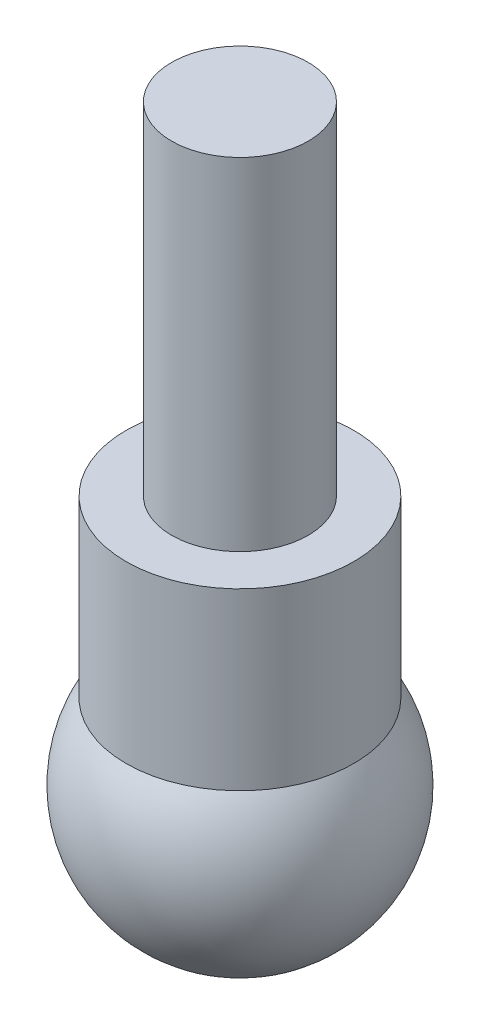
ISO-10303-21;
HEADER;
FILE_DESCRIPTION(('STEP AP214'),'2;1');
FILE_NAME('part.step','',(''),(''),'','','');
FILE_SCHEMA(('AUTOMOTIVE_DESIGN { 1 0 10303 214 1 1 1 1 }'));
ENDSEC;
DATA;
#1=APPLICATION_CONTEXT('core data for automotive mechanical design processes');
#2=APPLICATION_PROTOCOL_DEFINITION('international standard','automotive_design',2000,#1);
#3=PRODUCT_CONTEXT('',#1,'mechanical');
#4=PRODUCT('Part','Part','',(#3));
#5=PRODUCT_RELATED_PRODUCT_CATEGORY('part','',(#4));
#6=PRODUCT_DEFINITION_FORMATION('','',#4);
#7=PRODUCT_DEFINITION_CONTEXT('part definition',#1,'design');
#8=PRODUCT_DEFINITION('design','',#6,#7);
#9=PRODUCT_DEFINITION_SHAPE('','',#8);
#10=(LENGTH_UNIT() NAMED_UNIT(*) SI_UNIT(.MILLI.,.METRE.));
#11=(NAMED_UNIT(*) PLANE_ANGLE_UNIT() SI_UNIT($,.RADIAN.));
#12=(NAMED_UNIT(*) SI_UNIT($,.STERADIAN.) SOLID_ANGLE_UNIT());
#13=UNCERTAINTY_MEASURE_WITH_UNIT(LENGTH_MEASURE(1.E-05),#10,'distance_accuracy_value','');
#14=(GEOMETRIC_REPRESENTATION_CONTEXT(3) GLOBAL_UNCERTAINTY_ASSIGNED_CONTEXT((#13)) GLOBAL_UNIT_ASSIGNED_CONTEXT((#10,
#11,#12)) REPRESENTATION_CONTEXT('',''));
#15=CARTESIAN_POINT('',(0.,0.,0.));
#16=DIRECTION('',(0.,0.,1.));
#17=DIRECTION('',(1.,0.,0.));
#18=AXIS2_PLACEMENT_3D('',#15,#16,#17);
#19=CARTESIAN_POINT('',(0.,26.,0.));
#20=DIRECTION('',(0.,-1.,0.));
#21=DIRECTION('',(0.,0.,-1.));
#22=AXIS2_PLACEMENT_3D('',#19,#20,#21);
#23=PLANE('',#22);
#24=CARTESIAN_POINT('',(0.,26.,0.));
#25=DIRECTION('',(0.,1.,0.));
#26=DIRECTION('',(0.,0.,1.));
#27=AXIS2_PLACEMENT_3D('',#24,#25,#26);
#28=CIRCLE('',#27,3.);
#29=CARTESIAN_POINT('',(0.,26.,3.));
#30=VERTEX_POINT('',#29);
#31=EDGE_CURVE('E47',#30,#30,#28,.T.);
#32=ORIENTED_EDGE('',*,*,#31,.T.);
#33=EDGE_LOOP('',(#32));
#34=FACE_BOUND('',#33,.T.);
#35=ADVANCED_FACE('F33',(#34),#23,.F.);
#36=CARTESIAN_POINT('',(0.,0.,0.));
#37=DIRECTION('',(0.,1.,0.));
#38=DIRECTION('',(-1.,0.,0.));
#39=AXIS2_PLACEMENT_3D('',#36,#37,#38);
#40=SPHERICAL_SURFACE('',#39,6.);
#41=CARTESIAN_POINT('',(0.,3.3166247903554,0.));
#42=DIRECTION('',(0.,1.,0.));
#43=DIRECTION('',(0.,0.,1.));
#44=AXIS2_PLACEMENT_3D('',#41,#42,#43);
#45=CIRCLE('',#44,5.);
#46=CARTESIAN_POINT('',(0.,3.3166247903554,5.));
#47=VERTEX_POINT('',#46);
#48=EDGE_CURVE('E10',#47,#47,#45,.T.);
#49=ORIENTED_EDGE('',*,*,#48,.F.);
#50=EDGE_LOOP('',(#49));
#51=FACE_BOUND('',#50,.T.);
#52=ADVANCED_FACE('F67',(#51),#40,.T.);
#53=CARTESIAN_POINT('',(0.,26.,0.));
#54=DIRECTION('',(0.,1.,0.));
#55=DIRECTION('',(0.,0.,1.));
#56=AXIS2_PLACEMENT_3D('',#53,#54,#55);
#57=CYLINDRICAL_SURFACE('',#56,5.);
#58=CARTESIAN_POINT('',(0.,11.,0.));
#59=DIRECTION('',(0.,1.,0.));
#60=DIRECTION('',(0.,0.,1.));
#61=AXIS2_PLACEMENT_3D('',#58,#59,#60);
#62=CIRCLE('',#61,5.);
#63=CARTESIAN_POINT('',(0.,11.,5.));
#64=VERTEX_POINT('',#63);
#65=EDGE_CURVE('E39',#64,#64,#62,.T.);
#66=ORIENTED_EDGE('',*,*,#65,.F.);
#67=EDGE_LOOP('',(#66));
#68=FACE_BOUND('',#67,.T.);
#69=ORIENTED_EDGE('',*,*,#48,.T.);
#70=EDGE_LOOP('',(#69));
#71=FACE_BOUND('',#70,.T.);
#72=ADVANCED_FACE('F62',(#68,#71),#57,.T.);
#73=CARTESIAN_POINT('',(3.,11.,0.));
#74=DIRECTION('',(0.,-1.,0.));
#75=DIRECTION('',(0.,0.,-1.));
#76=AXIS2_PLACEMENT_3D('',#73,#74,#75);
#77=PLANE('',#76);
#78=CARTESIAN_POINT('',(0.,11.,0.));
#79=DIRECTION('',(0.,1.,0.));
#80=DIRECTION('',(0.,0.,1.));
#81=AXIS2_PLACEMENT_3D('',#78,#79,#80);
#82=CIRCLE('',#81,3.);
#83=CARTESIAN_POINT('',(0.,11.,3.));
#84=VERTEX_POINT('',#83);
#85=EDGE_CURVE('E43',#84,#84,#82,.T.);
#86=ORIENTED_EDGE('',*,*,#85,.F.);
#87=EDGE_LOOP('',(#86));
#88=FACE_BOUND('',#87,.T.);
#89=ORIENTED_EDGE('',*,*,#65,.T.);
#90=EDGE_LOOP('',(#89));
#91=FACE_BOUND('',#90,.T.);
#92=ADVANCED_FACE('F57',(#88,#91),#77,.F.);
#93=CARTESIAN_POINT('',(0.,26.,0.));
#94=DIRECTION('',(0.,1.,0.));
#95=DIRECTION('',(0.,0.,1.));
#96=AXIS2_PLACEMENT_3D('',#93,#94,#95);
#97=CYLINDRICAL_SURFACE('',#96,3.);
#98=ORIENTED_EDGE('',*,*,#31,.F.);
#99=EDGE_LOOP('',(#98));
#100=FACE_BOUND('',#99,.T.);
#101=ORIENTED_EDGE('',*,*,#85,.T.);
#102=EDGE_LOOP('',(#101));
#103=FACE_BOUND('',#102,.T.);
#104=ADVANCED_FACE('F54',(#100,#103),#97,.T.);
#105=CLOSED_SHELL('',(#35,#52,#72,#92,#104));
#106=MANIFOLD_SOLID_BREP('B2',#105);
#107=ADVANCED_BREP_SHAPE_REPRESENTATION('',(#18,#106),#14);
#108=SHAPE_DEFINITION_REPRESENTATION(#9,#107);
ENDSEC;
END-ISO-10303-21;
